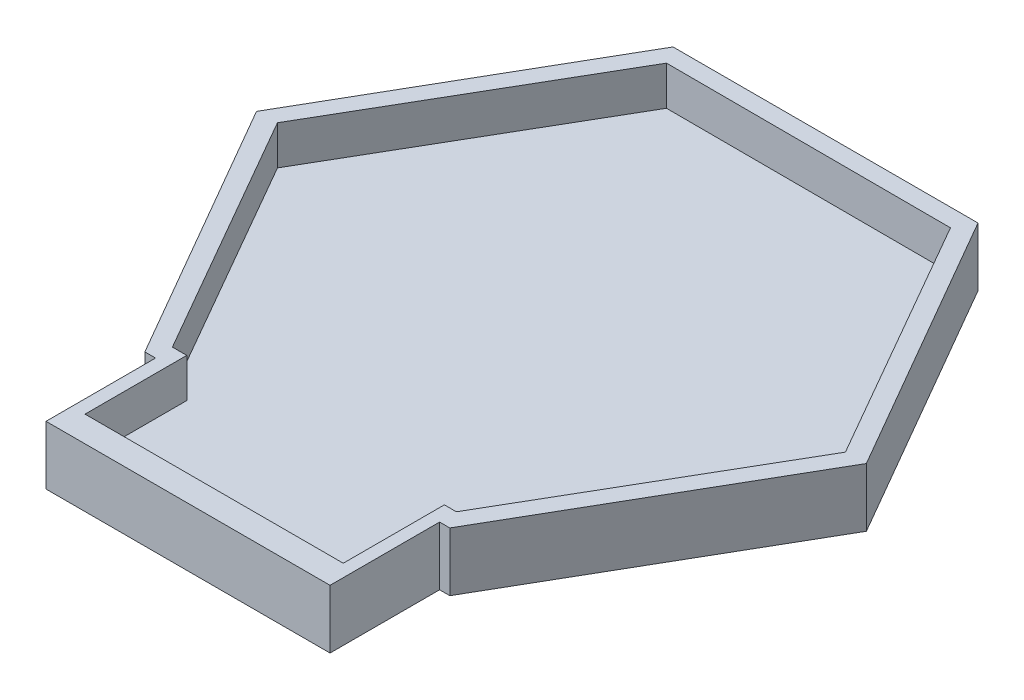
ISO-10303-21;
HEADER;
FILE_DESCRIPTION(('STEP AP214'),'2;1');
FILE_NAME('part.step','',(''),(''),'','','');
FILE_SCHEMA(('AUTOMOTIVE_DESIGN { 1 0 10303 214 1 1 1 1 }'));
ENDSEC;
DATA;
#1=APPLICATION_CONTEXT('core data for automotive mechanical design processes');
#2=APPLICATION_PROTOCOL_DEFINITION('international standard','automotive_design',2000,#1);
#3=PRODUCT_CONTEXT('',#1,'mechanical');
#4=PRODUCT('Part','Part','',(#3));
#5=PRODUCT_RELATED_PRODUCT_CATEGORY('part','',(#4));
#6=PRODUCT_DEFINITION_FORMATION('','',#4);
#7=PRODUCT_DEFINITION_CONTEXT('part definition',#1,'design');
#8=PRODUCT_DEFINITION('design','',#6,#7);
#9=PRODUCT_DEFINITION_SHAPE('','',#8);
#10=(LENGTH_UNIT() NAMED_UNIT(*) SI_UNIT(.MILLI.,.METRE.));
#11=(NAMED_UNIT(*) PLANE_ANGLE_UNIT() SI_UNIT($,.RADIAN.));
#12=(NAMED_UNIT(*) SI_UNIT($,.STERADIAN.) SOLID_ANGLE_UNIT());
#13=UNCERTAINTY_MEASURE_WITH_UNIT(LENGTH_MEASURE(1.E-05),#10,'distance_accuracy_value','');
#14=(GEOMETRIC_REPRESENTATION_CONTEXT(3) GLOBAL_UNCERTAINTY_ASSIGNED_CONTEXT((#13)) GLOBAL_UNIT_ASSIGNED_CONTEXT((#10,
#11,#12)) REPRESENTATION_CONTEXT('',''));
#15=CARTESIAN_POINT('',(0.,0.,0.));
#16=DIRECTION('',(0.,0.,1.));
#17=DIRECTION('',(1.,0.,0.));
#18=AXIS2_PLACEMENT_3D('',#15,#16,#17);
#19=CARTESIAN_POINT('',(5.64870289125176E-13,19.05,85.7250000000002));
#20=DIRECTION('',(0.,0.,-1.));
#21=DIRECTION('',(-1.,0.,0.));
#22=AXIS2_PLACEMENT_3D('',#19,#20,#21);
#23=PLANE('',#22);
#24=DIRECTION('',(1.,0.,0.));
#25=VECTOR('',#24,1.);
#26=CARTESIAN_POINT('',(5.64870289125176E-13,0.,85.7250000000002));
#27=LINE('',#26,#25);
#28=CARTESIAN_POINT('',(-49.4933518262799,0.,85.7250000000005));
#29=VERTEX_POINT('',#28);
#30=CARTESIAN_POINT('',(-46.0239134312924,0.,85.7250000000005));
#31=VERTEX_POINT('',#30);
#32=EDGE_CURVE('E190',#29,#31,#27,.T.);
#33=ORIENTED_EDGE('',*,*,#32,.T.);
#34=DIRECTION('',(0.,-1.,0.));
#35=VECTOR('',#34,1.);
#36=CARTESIAN_POINT('',(-46.0239134312924,19.05,85.7250000000005));
#37=LINE('',#36,#35);
#38=CARTESIAN_POINT('',(-46.0239134312924,19.05,85.7250000000005));
#39=VERTEX_POINT('',#38);
#40=EDGE_CURVE('E12',#39,#31,#37,.T.);
#41=ORIENTED_EDGE('',*,*,#40,.F.);
#42=DIRECTION('',(1.,0.,0.));
#43=VECTOR('',#42,1.);
#44=CARTESIAN_POINT('',(5.64870289125176E-13,19.05,85.7250000000002));
#45=LINE('',#44,#43);
#46=CARTESIAN_POINT('',(-49.4933518262799,19.05,85.7250000000005));
#47=VERTEX_POINT('',#46);
#48=EDGE_CURVE('E211',#47,#39,#45,.T.);
#49=ORIENTED_EDGE('',*,*,#48,.F.);
#50=DIRECTION('',(0.,-1.,0.));
#51=VECTOR('',#50,1.);
#52=CARTESIAN_POINT('',(-49.4933518262799,19.05,85.7250000000005));
#53=LINE('',#52,#51);
#54=EDGE_CURVE('E186',#47,#29,#53,.T.);
#55=ORIENTED_EDGE('',*,*,#54,.T.);
#56=EDGE_LOOP('',(#33,#41,#49,#55));
#57=FACE_BOUND('',#56,.T.);
#58=ADVANCED_FACE('F69',(#57),#23,.F.);
#59=CARTESIAN_POINT('',(-46.0239134312929,19.05,2.6044140939056E-13));
#60=DIRECTION('',(1.,0.,0.));
#61=DIRECTION('',(0.,0.,-1.));
#62=AXIS2_PLACEMENT_3D('',#59,#60,#61);
#63=PLANE('',#62);
#64=DIRECTION('',(0.,0.,1.));
#65=VECTOR('',#64,1.);
#66=CARTESIAN_POINT('',(-46.0239134312929,0.,2.6044140939056E-13));
#67=LINE('',#66,#65);
#68=CARTESIAN_POINT('',(-46.0239134312922,0.,121.285));
#69=VERTEX_POINT('',#68);
#70=EDGE_CURVE('E193',#31,#69,#67,.T.);
#71=ORIENTED_EDGE('',*,*,#70,.T.);
#72=DIRECTION('',(0.,-1.,0.));
#73=VECTOR('',#72,1.);
#74=CARTESIAN_POINT('',(-46.0239134312922,19.05,121.285));
#75=LINE('',#74,#73);
#76=CARTESIAN_POINT('',(-46.0239134312922,19.05,121.285));
#77=VERTEX_POINT('',#76);
#78=EDGE_CURVE('E77',#77,#69,#75,.T.);
#79=ORIENTED_EDGE('',*,*,#78,.F.);
#80=DIRECTION('',(0.,0.,1.));
#81=VECTOR('',#80,1.);
#82=CARTESIAN_POINT('',(-46.0239134312929,19.05,2.6044140939056E-13));
#83=LINE('',#82,#81);
#84=EDGE_CURVE('E140',#39,#77,#83,.T.);
#85=ORIENTED_EDGE('',*,*,#84,.F.);
#86=ORIENTED_EDGE('',*,*,#40,.T.);
#87=EDGE_LOOP('',(#71,#79,#85,#86));
#88=FACE_BOUND('',#87,.T.);
#89=ADVANCED_FACE('F71',(#88),#63,.F.);
#90=CARTESIAN_POINT('',(0.,19.05,121.285));
#91=DIRECTION('',(0.,0.,-1.));
#92=DIRECTION('',(-1.,0.,0.));
#93=AXIS2_PLACEMENT_3D('',#90,#91,#92);
#94=PLANE('',#93);
#95=DIRECTION('',(1.,0.,0.));
#96=VECTOR('',#95,1.);
#97=CARTESIAN_POINT('',(0.,0.,121.285));
#98=LINE('',#97,#96);
#99=CARTESIAN_POINT('',(46.1780865687078,0.,121.285));
#100=VERTEX_POINT('',#99);
#101=EDGE_CURVE('E197',#69,#100,#98,.T.);
#102=ORIENTED_EDGE('',*,*,#101,.T.);
#103=DIRECTION('',(0.,-1.,0.));
#104=VECTOR('',#103,1.);
#105=CARTESIAN_POINT('',(46.1780865687078,19.05,121.285));
#106=LINE('',#105,#104);
#107=CARTESIAN_POINT('',(46.1780865687078,19.05,121.285));
#108=VERTEX_POINT('',#107);
#109=EDGE_CURVE('E223',#108,#100,#106,.T.);
#110=ORIENTED_EDGE('',*,*,#109,.F.);
#111=DIRECTION('',(1.,0.,0.));
#112=VECTOR('',#111,1.);
#113=CARTESIAN_POINT('',(0.,19.05,121.285));
#114=LINE('',#113,#112);
#115=EDGE_CURVE('E230',#77,#108,#114,.T.);
#116=ORIENTED_EDGE('',*,*,#115,.F.);
#117=ORIENTED_EDGE('',*,*,#78,.T.);
#118=EDGE_LOOP('',(#102,#110,#116,#117));
#119=FACE_BOUND('',#118,.T.);
#120=ADVANCED_FACE('F228',(#119),#94,.F.);
#121=CARTESIAN_POINT('',(46.1780865687071,19.05,-2.6131384865538E-13));
#122=DIRECTION('',(1.,0.,0.));
#123=DIRECTION('',(0.,0.,-1.));
#124=AXIS2_PLACEMENT_3D('',#121,#122,#123);
#125=PLANE('',#124);
#126=DIRECTION('',(0.,0.,1.));
#127=VECTOR('',#126,1.);
#128=CARTESIAN_POINT('',(46.1780865687071,0.,-2.6131384865538E-13));
#129=LINE('',#128,#127);
#130=CARTESIAN_POINT('',(46.1780865687076,0.,85.7249999999999));
#131=VERTEX_POINT('',#130);
#132=EDGE_CURVE('E200',#131,#100,#129,.T.);
#133=ORIENTED_EDGE('',*,*,#132,.F.);
#134=DIRECTION('',(0.,-1.,0.));
#135=VECTOR('',#134,1.);
#136=CARTESIAN_POINT('',(46.1780865687076,19.05,85.7249999999999));
#137=LINE('',#136,#135);
#138=CARTESIAN_POINT('',(46.1780865687076,19.05,85.7249999999999));
#139=VERTEX_POINT('',#138);
#140=EDGE_CURVE('E221',#139,#131,#137,.T.);
#141=ORIENTED_EDGE('',*,*,#140,.F.);
#142=DIRECTION('',(0.,0.,1.));
#143=VECTOR('',#142,1.);
#144=CARTESIAN_POINT('',(46.1780865687071,19.05,-2.6131384865538E-13));
#145=LINE('',#144,#143);
#146=EDGE_CURVE('E242',#139,#108,#145,.T.);
#147=ORIENTED_EDGE('',*,*,#146,.T.);
#148=ORIENTED_EDGE('',*,*,#109,.T.);
#149=EDGE_LOOP('',(#133,#141,#147,#148));
#150=FACE_BOUND('',#149,.T.);
#151=ADVANCED_FACE('F238',(#150),#125,.T.);
#152=CARTESIAN_POINT('',(49.4933518262809,0.,85.7249999999999));
#153=VERTEX_POINT('',#152);
#154=EDGE_CURVE('E195',#131,#153,#27,.T.);
#155=ORIENTED_EDGE('',*,*,#154,.T.);
#156=DIRECTION('',(0.,-1.,0.));
#157=VECTOR('',#156,1.);
#158=CARTESIAN_POINT('',(49.4933518262809,19.05,85.7249999999999));
#159=LINE('',#158,#157);
#160=CARTESIAN_POINT('',(49.4933518262809,19.05,85.7249999999999));
#161=VERTEX_POINT('',#160);
#162=EDGE_CURVE('E218',#161,#153,#159,.T.);
#163=ORIENTED_EDGE('',*,*,#162,.F.);
#164=EDGE_CURVE('E243',#139,#161,#45,.T.);
#165=ORIENTED_EDGE('',*,*,#164,.F.);
#166=ORIENTED_EDGE('',*,*,#140,.T.);
#167=EDGE_LOOP('',(#155,#163,#165,#166));
#168=FACE_BOUND('',#167,.T.);
#169=ADVANCED_FACE('F441',(#168),#23,.F.);
#170=CARTESIAN_POINT('',(74.2400277394211,19.05,42.8624999999998));
#171=DIRECTION('',(-0.86602540378444,0.,-0.499999999999998));
#172=DIRECTION('',(-0.499999999999998,0.,0.86602540378444));
#173=AXIS2_PLACEMENT_3D('',#170,#171,#172);
#174=PLANE('',#173);
#175=DIRECTION('',(0.499999999999998,0.,-0.86602540378444));
#176=VECTOR('',#175,1.);
#177=CARTESIAN_POINT('',(74.2400277394211,0.,42.8624999999998));
#178=LINE('',#177,#176);
#179=CARTESIAN_POINT('',(98.9867036525613,0.,-2.08166817117217E-13));
#180=VERTEX_POINT('',#179);
#181=EDGE_CURVE('E203',#153,#180,#178,.T.);
#182=ORIENTED_EDGE('',*,*,#181,.T.);
#183=DIRECTION('',(0.,-1.,0.));
#184=VECTOR('',#183,1.);
#185=CARTESIAN_POINT('',(98.9867036525613,19.05,-2.08166817117217E-13));
#186=LINE('',#185,#184);
#187=CARTESIAN_POINT('',(98.9867036525613,19.05,-2.08166817117217E-13));
#188=VERTEX_POINT('',#187);
#189=EDGE_CURVE('E215',#188,#180,#186,.T.);
#190=ORIENTED_EDGE('',*,*,#189,.F.);
#191=DIRECTION('',(0.499999999999998,0.,-0.86602540378444));
#192=VECTOR('',#191,1.);
#193=CARTESIAN_POINT('',(74.2400277394211,19.05,42.8624999999998));
#194=LINE('',#193,#192);
#195=EDGE_CURVE('E245',#161,#188,#194,.T.);
#196=ORIENTED_EDGE('',*,*,#195,.F.);
#197=ORIENTED_EDGE('',*,*,#162,.T.);
#198=EDGE_LOOP('',(#182,#190,#196,#197));
#199=FACE_BOUND('',#198,.T.);
#200=ADVANCED_FACE('F254',(#199),#174,.F.);
#201=CARTESIAN_POINT('',(74.2400277394209,19.05,-42.8625000000002));
#202=DIRECTION('',(-0.866025403784437,0.,0.500000000000002));
#203=DIRECTION('',(0.500000000000002,0.,0.866025403784437));
#204=AXIS2_PLACEMENT_3D('',#201,#202,#203);
#205=PLANE('',#204);
#206=DIRECTION('',(-0.500000000000002,0.,-0.866025403784437));
#207=VECTOR('',#206,1.);
#208=CARTESIAN_POINT('',(74.2400277394209,0.,-42.8625000000002));
#209=LINE('',#208,#207);
#210=CARTESIAN_POINT('',(49.4933518262804,0.,-85.7250000000001));
#211=VERTEX_POINT('',#210);
#212=EDGE_CURVE('E205',#180,#211,#209,.T.);
#213=ORIENTED_EDGE('',*,*,#212,.T.);
#214=DIRECTION('',(0.,-1.,0.));
#215=VECTOR('',#214,1.);
#216=CARTESIAN_POINT('',(49.4933518262804,19.05,-85.7250000000001));
#217=LINE('',#216,#215);
#218=CARTESIAN_POINT('',(49.4933518262804,19.05,-85.7250000000001));
#219=VERTEX_POINT('',#218);
#220=EDGE_CURVE('E181',#219,#211,#217,.T.);
#221=ORIENTED_EDGE('',*,*,#220,.F.);
#222=DIRECTION('',(-0.500000000000002,0.,-0.866025403784437));
#223=VECTOR('',#222,1.);
#224=CARTESIAN_POINT('',(74.2400277394209,19.05,-42.8625000000002));
#225=LINE('',#224,#223);
#226=EDGE_CURVE('E169',#188,#219,#225,.T.);
#227=ORIENTED_EDGE('',*,*,#226,.F.);
#228=ORIENTED_EDGE('',*,*,#189,.T.);
#229=EDGE_LOOP('',(#213,#221,#227,#228));
#230=FACE_BOUND('',#229,.T.);
#231=ADVANCED_FACE('F257',(#230),#205,.F.);
#232=CARTESIAN_POINT('',(-2.16333302218151E-13,19.05,-85.725));
#233=DIRECTION('',(0.,0.,1.));
#234=DIRECTION('',(1.,0.,0.));
#235=AXIS2_PLACEMENT_3D('',#232,#233,#234);
#236=PLANE('',#235);
#237=DIRECTION('',(-1.,0.,0.));
#238=VECTOR('',#237,1.);
#239=CARTESIAN_POINT('',(-2.16333302218151E-13,0.,-85.725));
#240=LINE('',#239,#238);
#241=CARTESIAN_POINT('',(-49.4933518262811,0.,-85.7249999999999));
#242=VERTEX_POINT('',#241);
#243=EDGE_CURVE('E178',#211,#242,#240,.T.);
#244=ORIENTED_EDGE('',*,*,#243,.T.);
#245=DIRECTION('',(0.,-1.,0.));
#246=VECTOR('',#245,1.);
#247=CARTESIAN_POINT('',(-49.4933518262811,19.05,-85.7249999999999));
#248=LINE('',#247,#246);
#249=CARTESIAN_POINT('',(-49.4933518262811,19.05,-85.7249999999999));
#250=VERTEX_POINT('',#249);
#251=EDGE_CURVE('E175',#250,#242,#248,.T.);
#252=ORIENTED_EDGE('',*,*,#251,.F.);
#253=DIRECTION('',(-1.,0.,0.));
#254=VECTOR('',#253,1.);
#255=CARTESIAN_POINT('',(-2.16333302218151E-13,19.05,-85.725));
#256=LINE('',#255,#254);
#257=EDGE_CURVE('E162',#219,#250,#256,.T.);
#258=ORIENTED_EDGE('',*,*,#257,.F.);
#259=ORIENTED_EDGE('',*,*,#220,.T.);
#260=EDGE_LOOP('',(#244,#252,#258,#259));
#261=FACE_BOUND('',#260,.T.);
#262=ADVANCED_FACE('F176',(#261),#236,.F.);
#263=CARTESIAN_POINT('',(-74.2400277394213,19.05,-42.8624999999996));
#264=DIRECTION('',(0.866025403784442,0.,0.499999999999995));
#265=DIRECTION('',(0.499999999999995,0.,-0.866025403784442));
#266=AXIS2_PLACEMENT_3D('',#263,#264,#265);
#267=PLANE('',#266);
#268=DIRECTION('',(-0.499999999999995,0.,0.866025403784442));
#269=VECTOR('',#268,1.);
#270=CARTESIAN_POINT('',(-74.2400277394213,0.,-42.8624999999996));
#271=LINE('',#270,#269);
#272=CARTESIAN_POINT('',(-98.9867036525614,0.,6.86950496486816E-13));
#273=VERTEX_POINT('',#272);
#274=EDGE_CURVE('E208',#242,#273,#271,.T.);
#275=ORIENTED_EDGE('',*,*,#274,.T.);
#276=DIRECTION('',(0.,-1.,0.));
#277=VECTOR('',#276,1.);
#278=CARTESIAN_POINT('',(-98.9867036525614,19.05,6.86950496486816E-13));
#279=LINE('',#278,#277);
#280=CARTESIAN_POINT('',(-98.9867036525614,19.05,6.86950496486816E-13));
#281=VERTEX_POINT('',#280);
#282=EDGE_CURVE('E182',#281,#273,#279,.T.);
#283=ORIENTED_EDGE('',*,*,#282,.F.);
#284=DIRECTION('',(-0.499999999999995,0.,0.866025403784442));
#285=VECTOR('',#284,1.);
#286=CARTESIAN_POINT('',(-74.2400277394213,19.05,-42.8624999999996));
#287=LINE('',#286,#285);
#288=EDGE_CURVE('E166',#250,#281,#287,.T.);
#289=ORIENTED_EDGE('',*,*,#288,.F.);
#290=ORIENTED_EDGE('',*,*,#251,.T.);
#291=EDGE_LOOP('',(#275,#283,#289,#290));
#292=FACE_BOUND('',#291,.T.);
#293=ADVANCED_FACE('F184',(#292),#267,.F.);
#294=CARTESIAN_POINT('',(-74.2400277394207,19.05,42.8625000000006));
#295=DIRECTION('',(0.866025403784434,0.,-0.500000000000007));
#296=DIRECTION('',(-0.500000000000007,0.,-0.866025403784435));
#297=AXIS2_PLACEMENT_3D('',#294,#295,#296);
#298=PLANE('',#297);
#299=DIRECTION('',(0.500000000000007,0.,0.866025403784435));
#300=VECTOR('',#299,1.);
#301=CARTESIAN_POINT('',(-74.2400277394207,0.,42.8625000000006));
#302=LINE('',#301,#300);
#303=EDGE_CURVE('E132',#273,#29,#302,.T.);
#304=ORIENTED_EDGE('',*,*,#303,.T.);
#305=ORIENTED_EDGE('',*,*,#54,.F.);
#306=DIRECTION('',(0.500000000000007,0.,0.866025403784435));
#307=VECTOR('',#306,1.);
#308=CARTESIAN_POINT('',(-74.2400277394207,19.05,42.8625000000006));
#309=LINE('',#308,#307);
#310=EDGE_CURVE('E93',#281,#47,#309,.T.);
#311=ORIENTED_EDGE('',*,*,#310,.F.);
#312=ORIENTED_EDGE('',*,*,#282,.T.);
#313=EDGE_LOOP('',(#304,#305,#311,#312));
#314=FACE_BOUND('',#313,.T.);
#315=ADVANCED_FACE('F258',(#314),#298,.F.);
#316=CARTESIAN_POINT('',(0.,19.05,0.));
#317=DIRECTION('',(0.,1.,0.));
#318=DIRECTION('',(0.,0.,1.));
#319=AXIS2_PLACEMENT_3D('',#316,#317,#318);
#320=PLANE('',#319);
#321=DIRECTION('',(0.498029058173314,0.,0.867160341122103));
#322=VECTOR('',#321,1.);
#323=CARTESIAN_POINT('',(-92.387351129337,19.05,-0.21012211830998));
#324=LINE('',#323,#322);
#325=CARTESIAN_POINT('',(-92.387351129337,19.05,-0.21012211830998));
#326=VERTEX_POINT('',#325);
#327=CARTESIAN_POINT('',(-46.3756466570219,19.05,79.9047320072038));
#328=VERTEX_POINT('',#327);
#329=EDGE_CURVE('E299',#326,#328,#324,.T.);
#330=ORIENTED_EDGE('',*,*,#329,.F.);
#331=DIRECTION('',(-0.501968355479463,0.,0.86488598676198));
#332=VECTOR('',#331,1.);
#333=CARTESIAN_POINT('',(-46.011704472315,19.05,-80.1148541255137));
#334=LINE('',#333,#332);
#335=CARTESIAN_POINT('',(-46.011704472315,19.05,-80.1148541255137));
#336=VERTEX_POINT('',#335);
#337=EDGE_CURVE('E282',#336,#326,#334,.T.);
#338=ORIENTED_EDGE('',*,*,#337,.F.);
#339=DIRECTION('',(-0.999997413652778,0.,-0.00227435436012316));
#340=VECTOR('',#339,1.);
#341=CARTESIAN_POINT('',(46.3756466570219,19.05,-79.9047320072037));
#342=LINE('',#341,#340);
#343=CARTESIAN_POINT('',(46.3756466570219,19.05,-79.9047320072037));
#344=VERTEX_POINT('',#343);
#345=EDGE_CURVE('E286',#344,#336,#342,.T.);
#346=ORIENTED_EDGE('',*,*,#345,.F.);
#347=DIRECTION('',(-0.498029058173314,0.,-0.867160341122103));
#348=VECTOR('',#347,1.);
#349=CARTESIAN_POINT('',(92.3873511293369,19.05,0.21012211831001));
#350=LINE('',#349,#348);
#351=CARTESIAN_POINT('',(92.3873511293369,19.05,0.21012211831001));
#352=VERTEX_POINT('',#351);
#353=EDGE_CURVE('E289',#352,#344,#350,.T.);
#354=ORIENTED_EDGE('',*,*,#353,.F.);
#355=DIRECTION('',(0.501968355479464,0.,-0.864885986761979));
#356=VECTOR('',#355,1.);
#357=CARTESIAN_POINT('',(46.011704472315,19.05,80.1148541255137));
#358=LINE('',#357,#356);
#359=CARTESIAN_POINT('',(46.011704472315,19.05,80.1148541255137));
#360=VERTEX_POINT('',#359);
#361=EDGE_CURVE('E292',#360,#352,#358,.T.);
#362=ORIENTED_EDGE('',*,*,#361,.F.);
#363=DIRECTION('',(0.999997413652778,0.,0.00227435436012316));
#364=VECTOR('',#363,1.);
#365=CARTESIAN_POINT('',(-46.3756466570219,19.05,79.9047320072038));
#366=LINE('',#365,#364);
#367=CARTESIAN_POINT('',(42.1145877624479,19.05,80.1059906782088));
#368=VERTEX_POINT('',#367);
#369=EDGE_CURVE('E298',#368,#360,#366,.T.);
#370=ORIENTED_EDGE('',*,*,#369,.F.);
#371=DIRECTION('',(0.,0.,1.));
#372=VECTOR('',#371,1.);
#373=CARTESIAN_POINT('',(42.1145877624479,19.05,0.));
#374=LINE('',#373,#372);
#375=CARTESIAN_POINT('',(42.1145877624479,19.05,112.93535380269));
#376=VERTEX_POINT('',#375);
#377=EDGE_CURVE('E84',#368,#376,#374,.T.);
#378=ORIENTED_EDGE('',*,*,#377,.T.);
#379=DIRECTION('',(1.,0.,0.));
#380=VECTOR('',#379,1.);
#381=CARTESIAN_POINT('',(0.,19.05,112.93535380269));
#382=LINE('',#381,#380);
#383=CARTESIAN_POINT('',(-41.7054122375521,19.05,112.93535380269));
#384=VERTEX_POINT('',#383);
#385=EDGE_CURVE('E329',#384,#376,#382,.T.);
#386=ORIENTED_EDGE('',*,*,#385,.F.);
#387=DIRECTION('',(0.,0.,1.));
#388=VECTOR('',#387,1.);
#389=CARTESIAN_POINT('',(-41.7054122375521,19.05,0.));
#390=LINE('',#389,#388);
#391=CARTESIAN_POINT('',(-41.7054122375611,19.05,79.9153538026901));
#392=VERTEX_POINT('',#391);
#393=EDGE_CURVE('E333',#392,#384,#390,.T.);
#394=ORIENTED_EDGE('',*,*,#393,.F.);
#395=EDGE_CURVE('E295',#328,#392,#366,.T.);
#396=ORIENTED_EDGE('',*,*,#395,.F.);
#397=EDGE_LOOP('',(#330,#338,#346,#354,#362,#370,#378,#386,#394,#396));
#398=FACE_BOUND('',#397,.T.);
#399=ORIENTED_EDGE('',*,*,#48,.T.);
#400=ORIENTED_EDGE('',*,*,#84,.T.);
#401=ORIENTED_EDGE('',*,*,#115,.T.);
#402=ORIENTED_EDGE('',*,*,#146,.F.);
#403=ORIENTED_EDGE('',*,*,#164,.T.);
#404=ORIENTED_EDGE('',*,*,#195,.T.);
#405=ORIENTED_EDGE('',*,*,#226,.T.);
#406=ORIENTED_EDGE('',*,*,#257,.T.);
#407=ORIENTED_EDGE('',*,*,#288,.T.);
#408=ORIENTED_EDGE('',*,*,#310,.T.);
#409=EDGE_LOOP('',(#399,#400,#401,#402,#403,#404,#405,#406,#407,#408));
#410=FACE_BOUND('',#409,.T.);
#411=ADVANCED_FACE('F164',(#398,#410),#320,.T.);
#412=CARTESIAN_POINT('',(0.,0.,0.));
#413=DIRECTION('',(0.,1.,0.));
#414=DIRECTION('',(0.,0.,1.));
#415=AXIS2_PLACEMENT_3D('',#412,#413,#414);
#416=PLANE('',#415);
#417=ORIENTED_EDGE('',*,*,#32,.F.);
#418=ORIENTED_EDGE('',*,*,#303,.F.);
#419=ORIENTED_EDGE('',*,*,#274,.F.);
#420=ORIENTED_EDGE('',*,*,#243,.F.);
#421=ORIENTED_EDGE('',*,*,#212,.F.);
#422=ORIENTED_EDGE('',*,*,#181,.F.);
#423=ORIENTED_EDGE('',*,*,#154,.F.);
#424=ORIENTED_EDGE('',*,*,#132,.T.);
#425=ORIENTED_EDGE('',*,*,#101,.F.);
#426=ORIENTED_EDGE('',*,*,#70,.F.);
#427=EDGE_LOOP('',(#417,#418,#419,#420,#421,#422,#423,#424,#425,#426));
#428=FACE_BOUND('',#427,.T.);
#429=ADVANCED_FACE('F233',(#428),#416,.F.);
#430=CARTESIAN_POINT('',(42.1145877624479,6.35,0.));
#431=DIRECTION('',(-1.,0.,0.));
#432=DIRECTION('',(0.,0.,1.));
#433=AXIS2_PLACEMENT_3D('',#430,#431,#432);
#434=PLANE('',#433);
#435=ORIENTED_EDGE('',*,*,#377,.F.);
#436=DIRECTION('',(0.,1.,0.));
#437=VECTOR('',#436,1.);
#438=CARTESIAN_POINT('',(42.1145877624479,6.35,80.1059906782088));
#439=LINE('',#438,#437);
#440=CARTESIAN_POINT('',(42.1145877624479,6.35,80.1059906782088));
#441=VERTEX_POINT('',#440);
#442=EDGE_CURVE('E319',#441,#368,#439,.T.);
#443=ORIENTED_EDGE('',*,*,#442,.F.);
#444=DIRECTION('',(0.,0.,1.));
#445=VECTOR('',#444,1.);
#446=CARTESIAN_POINT('',(42.1145877624479,6.35,0.));
#447=LINE('',#446,#445);
#448=CARTESIAN_POINT('',(42.1145877624479,6.35,112.93535380269));
#449=VERTEX_POINT('',#448);
#450=EDGE_CURVE('E332',#441,#449,#447,.T.);
#451=ORIENTED_EDGE('',*,*,#450,.T.);
#452=DIRECTION('',(0.,1.,0.));
#453=VECTOR('',#452,1.);
#454=CARTESIAN_POINT('',(42.1145877624479,6.35,112.93535380269));
#455=LINE('',#454,#453);
#456=EDGE_CURVE('E194',#449,#376,#455,.T.);
#457=ORIENTED_EDGE('',*,*,#456,.T.);
#458=EDGE_LOOP('',(#435,#443,#451,#457));
#459=FACE_BOUND('',#458,.T.);
#460=ADVANCED_FACE('F345',(#459),#434,.T.);
#461=CARTESIAN_POINT('',(0.,6.35,112.93535380269));
#462=DIRECTION('',(0.,0.,1.));
#463=DIRECTION('',(1.,0.,0.));
#464=AXIS2_PLACEMENT_3D('',#461,#462,#463);
#465=PLANE('',#464);
#466=ORIENTED_EDGE('',*,*,#385,.T.);
#467=ORIENTED_EDGE('',*,*,#456,.F.);
#468=DIRECTION('',(1.,0.,0.));
#469=VECTOR('',#468,1.);
#470=CARTESIAN_POINT('',(0.,6.35,112.93535380269));
#471=LINE('',#470,#469);
#472=CARTESIAN_POINT('',(-41.7054122375521,6.35,112.93535380269));
#473=VERTEX_POINT('',#472);
#474=EDGE_CURVE('E322',#473,#449,#471,.T.);
#475=ORIENTED_EDGE('',*,*,#474,.F.);
#476=DIRECTION('',(0.,1.,0.));
#477=VECTOR('',#476,1.);
#478=CARTESIAN_POINT('',(-41.7054122375521,6.35,112.93535380269));
#479=LINE('',#478,#477);
#480=EDGE_CURVE('E325',#473,#384,#479,.T.);
#481=ORIENTED_EDGE('',*,*,#480,.T.);
#482=EDGE_LOOP('',(#466,#467,#475,#481));
#483=FACE_BOUND('',#482,.T.);
#484=ADVANCED_FACE('F355',(#483),#465,.F.);
#485=CARTESIAN_POINT('',(-41.7054122375521,6.35,0.));
#486=DIRECTION('',(-1.,0.,0.));
#487=DIRECTION('',(0.,0.,1.));
#488=AXIS2_PLACEMENT_3D('',#485,#486,#487);
#489=PLANE('',#488);
#490=ORIENTED_EDGE('',*,*,#393,.T.);
#491=ORIENTED_EDGE('',*,*,#480,.F.);
#492=DIRECTION('',(0.,0.,1.));
#493=VECTOR('',#492,1.);
#494=CARTESIAN_POINT('',(-41.7054122375521,6.35,0.));
#495=LINE('',#494,#493);
#496=CARTESIAN_POINT('',(-41.7054122375611,6.35,79.9153538026901));
#497=VERTEX_POINT('',#496);
#498=EDGE_CURVE('E339',#497,#473,#495,.T.);
#499=ORIENTED_EDGE('',*,*,#498,.F.);
#500=DIRECTION('',(0.,1.,0.));
#501=VECTOR('',#500,1.);
#502=CARTESIAN_POINT('',(-41.7054122375611,6.35,79.9153538026901));
#503=LINE('',#502,#501);
#504=EDGE_CURVE('E321',#497,#392,#503,.T.);
#505=ORIENTED_EDGE('',*,*,#504,.T.);
#506=EDGE_LOOP('',(#490,#491,#499,#505));
#507=FACE_BOUND('',#506,.T.);
#508=ADVANCED_FACE('F364',(#507),#489,.F.);
#509=CARTESIAN_POINT('',(0.,6.35,0.));
#510=DIRECTION('',(0.,1.,0.));
#511=DIRECTION('',(0.,0.,1.));
#512=AXIS2_PLACEMENT_3D('',#509,#510,#511);
#513=PLANE('',#512);
#514=ORIENTED_EDGE('',*,*,#450,.F.);
#515=DIRECTION('',(0.999997413652778,0.,0.00227435436012316));
#516=VECTOR('',#515,1.);
#517=CARTESIAN_POINT('',(-46.3756466570219,6.35,79.9047320072038));
#518=LINE('',#517,#516);
#519=CARTESIAN_POINT('',(46.011704472315,6.35,80.1148541255137));
#520=VERTEX_POINT('',#519);
#521=EDGE_CURVE('E316',#441,#520,#518,.T.);
#522=ORIENTED_EDGE('',*,*,#521,.T.);
#523=DIRECTION('',(0.501968355479464,0.,-0.864885986761979));
#524=VECTOR('',#523,1.);
#525=CARTESIAN_POINT('',(46.011704472315,6.35,80.1148541255137));
#526=LINE('',#525,#524);
#527=CARTESIAN_POINT('',(92.3873511293369,6.35,0.21012211831001));
#528=VERTEX_POINT('',#527);
#529=EDGE_CURVE('E310',#520,#528,#526,.T.);
#530=ORIENTED_EDGE('',*,*,#529,.T.);
#531=DIRECTION('',(-0.498029058173314,0.,-0.867160341122103));
#532=VECTOR('',#531,1.);
#533=CARTESIAN_POINT('',(92.3873511293369,6.35,0.21012211831001));
#534=LINE('',#533,#532);
#535=CARTESIAN_POINT('',(46.3756466570219,6.35,-79.9047320072037));
#536=VERTEX_POINT('',#535);
#537=EDGE_CURVE('E307',#528,#536,#534,.T.);
#538=ORIENTED_EDGE('',*,*,#537,.T.);
#539=DIRECTION('',(-0.999997413652778,0.,-0.00227435436012316));
#540=VECTOR('',#539,1.);
#541=CARTESIAN_POINT('',(46.3756466570219,6.35,-79.9047320072037));
#542=LINE('',#541,#540);
#543=CARTESIAN_POINT('',(-46.011704472315,6.35,-80.1148541255137));
#544=VERTEX_POINT('',#543);
#545=EDGE_CURVE('E304',#536,#544,#542,.T.);
#546=ORIENTED_EDGE('',*,*,#545,.T.);
#547=DIRECTION('',(-0.501968355479463,0.,0.86488598676198));
#548=VECTOR('',#547,1.);
#549=CARTESIAN_POINT('',(-46.011704472315,6.35,-80.1148541255137));
#550=LINE('',#549,#548);
#551=CARTESIAN_POINT('',(-92.387351129337,6.35,-0.21012211830998));
#552=VERTEX_POINT('',#551);
#553=EDGE_CURVE('E267',#544,#552,#550,.T.);
#554=ORIENTED_EDGE('',*,*,#553,.T.);
#555=DIRECTION('',(0.498029058173314,0.,0.867160341122103));
#556=VECTOR('',#555,1.);
#557=CARTESIAN_POINT('',(-92.387351129337,6.35,-0.21012211830998));
#558=LINE('',#557,#556);
#559=CARTESIAN_POINT('',(-46.3756466570219,6.35,79.9047320072038));
#560=VERTEX_POINT('',#559);
#561=EDGE_CURVE('E285',#552,#560,#558,.T.);
#562=ORIENTED_EDGE('',*,*,#561,.T.);
#563=EDGE_CURVE('E313',#560,#497,#518,.T.);
#564=ORIENTED_EDGE('',*,*,#563,.T.);
#565=ORIENTED_EDGE('',*,*,#498,.T.);
#566=ORIENTED_EDGE('',*,*,#474,.T.);
#567=EDGE_LOOP('',(#514,#522,#530,#538,#546,#554,#562,#564,#565,#566));
#568=FACE_BOUND('',#567,.T.);
#569=ADVANCED_FACE('F357',(#568),#513,.T.);
#570=CARTESIAN_POINT('',(92.3873511293369,6.35,0.21012211831001));
#571=DIRECTION('',(0.867160341122103,0.,-0.498029058173314));
#572=DIRECTION('',(-0.498029058173314,0.,-0.867160341122103));
#573=AXIS2_PLACEMENT_3D('',#570,#571,#572);
#574=PLANE('',#573);
#575=ORIENTED_EDGE('',*,*,#353,.T.);
#576=DIRECTION('',(0.,1.,0.));
#577=VECTOR('',#576,1.);
#578=CARTESIAN_POINT('',(46.3756466570219,6.35,-79.9047320072037));
#579=LINE('',#578,#577);
#580=EDGE_CURVE('E273',#536,#344,#579,.T.);
#581=ORIENTED_EDGE('',*,*,#580,.F.);
#582=ORIENTED_EDGE('',*,*,#537,.F.);
#583=DIRECTION('',(0.,1.,0.));
#584=VECTOR('',#583,1.);
#585=CARTESIAN_POINT('',(92.3873511293369,6.35,0.21012211831001));
#586=LINE('',#585,#584);
#587=EDGE_CURVE('E270',#528,#352,#586,.T.);
#588=ORIENTED_EDGE('',*,*,#587,.T.);
#589=EDGE_LOOP('',(#575,#581,#582,#588));
#590=FACE_BOUND('',#589,.T.);
#591=ADVANCED_FACE('F422',(#590),#574,.F.);
#592=CARTESIAN_POINT('',(46.3756466570219,6.35,-79.9047320072037));
#593=DIRECTION('',(0.00227435436012316,0.,-0.999997413652778));
#594=DIRECTION('',(-0.999997413652778,0.,-0.00227435436012316));
#595=AXIS2_PLACEMENT_3D('',#592,#593,#594);
#596=PLANE('',#595);
#597=ORIENTED_EDGE('',*,*,#345,.T.);
#598=DIRECTION('',(0.,1.,0.));
#599=VECTOR('',#598,1.);
#600=CARTESIAN_POINT('',(-46.011704472315,6.35,-80.1148541255137));
#601=LINE('',#600,#599);
#602=EDGE_CURVE('E276',#544,#336,#601,.T.);
#603=ORIENTED_EDGE('',*,*,#602,.F.);
#604=ORIENTED_EDGE('',*,*,#545,.F.);
#605=ORIENTED_EDGE('',*,*,#580,.T.);
#606=EDGE_LOOP('',(#597,#603,#604,#605));
#607=FACE_BOUND('',#606,.T.);
#608=ADVANCED_FACE('F417',(#607),#596,.F.);
#609=CARTESIAN_POINT('',(-46.011704472315,6.35,-80.1148541255137));
#610=DIRECTION('',(-0.864885986761979,0.,-0.501968355479463));
#611=DIRECTION('',(-0.501968355479463,0.,0.86488598676198));
#612=AXIS2_PLACEMENT_3D('',#609,#610,#611);
#613=PLANE('',#612);
#614=ORIENTED_EDGE('',*,*,#337,.T.);
#615=DIRECTION('',(0.,1.,0.));
#616=VECTOR('',#615,1.);
#617=CARTESIAN_POINT('',(-92.387351129337,6.35,-0.21012211830998));
#618=LINE('',#617,#616);
#619=EDGE_CURVE('E279',#552,#326,#618,.T.);
#620=ORIENTED_EDGE('',*,*,#619,.F.);
#621=ORIENTED_EDGE('',*,*,#553,.F.);
#622=ORIENTED_EDGE('',*,*,#602,.T.);
#623=EDGE_LOOP('',(#614,#620,#621,#622));
#624=FACE_BOUND('',#623,.T.);
#625=ADVANCED_FACE('F409',(#624),#613,.F.);
#626=CARTESIAN_POINT('',(46.011704472315,6.35,80.1148541255137));
#627=DIRECTION('',(0.864885986761979,0.,0.501968355479464));
#628=DIRECTION('',(0.501968355479464,0.,-0.86488598676198));
#629=AXIS2_PLACEMENT_3D('',#626,#627,#628);
#630=PLANE('',#629);
#631=ORIENTED_EDGE('',*,*,#361,.T.);
#632=ORIENTED_EDGE('',*,*,#587,.F.);
#633=ORIENTED_EDGE('',*,*,#529,.F.);
#634=DIRECTION('',(0.,1.,0.));
#635=VECTOR('',#634,1.);
#636=CARTESIAN_POINT('',(46.011704472315,6.35,80.1148541255137));
#637=LINE('',#636,#635);
#638=EDGE_CURVE('E266',#520,#360,#637,.T.);
#639=ORIENTED_EDGE('',*,*,#638,.T.);
#640=EDGE_LOOP('',(#631,#632,#633,#639));
#641=FACE_BOUND('',#640,.T.);
#642=ADVANCED_FACE('F425',(#641),#630,.F.);
#643=CARTESIAN_POINT('',(-92.387351129337,6.35,-0.21012211830998));
#644=DIRECTION('',(-0.867160341122103,0.,0.498029058173314));
#645=DIRECTION('',(0.498029058173314,0.,0.867160341122103));
#646=AXIS2_PLACEMENT_3D('',#643,#644,#645);
#647=PLANE('',#646);
#648=ORIENTED_EDGE('',*,*,#329,.T.);
#649=DIRECTION('',(0.,1.,0.));
#650=VECTOR('',#649,1.);
#651=CARTESIAN_POINT('',(-46.3756466570219,6.35,79.9047320072038));
#652=LINE('',#651,#650);
#653=EDGE_CURVE('E263',#560,#328,#652,.T.);
#654=ORIENTED_EDGE('',*,*,#653,.F.);
#655=ORIENTED_EDGE('',*,*,#561,.F.);
#656=ORIENTED_EDGE('',*,*,#619,.T.);
#657=EDGE_LOOP('',(#648,#654,#655,#656));
#658=FACE_BOUND('',#657,.T.);
#659=ADVANCED_FACE('F405',(#658),#647,.F.);
#660=CARTESIAN_POINT('',(-46.3756466570219,6.35,79.9047320072038));
#661=DIRECTION('',(-0.00227435436012316,0.,0.999997413652778));
#662=DIRECTION('',(0.999997413652778,0.,0.00227435436012316));
#663=AXIS2_PLACEMENT_3D('',#660,#661,#662);
#664=PLANE('',#663);
#665=ORIENTED_EDGE('',*,*,#563,.F.);
#666=ORIENTED_EDGE('',*,*,#653,.T.);
#667=ORIENTED_EDGE('',*,*,#395,.T.);
#668=ORIENTED_EDGE('',*,*,#504,.F.);
#669=EDGE_LOOP('',(#665,#666,#667,#668));
#670=FACE_BOUND('',#669,.T.);
#671=ADVANCED_FACE('F413',(#670),#664,.F.);
#672=ORIENTED_EDGE('',*,*,#442,.T.);
#673=ORIENTED_EDGE('',*,*,#369,.T.);
#674=ORIENTED_EDGE('',*,*,#638,.F.);
#675=ORIENTED_EDGE('',*,*,#521,.F.);
#676=EDGE_LOOP('',(#672,#673,#674,#675));
#677=FACE_BOUND('',#676,.T.);
#678=ADVANCED_FACE('F428',(#677),#664,.F.);
#679=CLOSED_SHELL('',(#58,#89,#120,#151,#169,#200,#231,#262,#293,#315,#411,#429,#460,#484,#508,
#569,#591,#608,#625,#642,#659,#671,#678));
#680=MANIFOLD_SOLID_BREP('B2',#679);
#681=ADVANCED_BREP_SHAPE_REPRESENTATION('',(#18,#680),#14);
#682=SHAPE_DEFINITION_REPRESENTATION(#9,#681);
ENDSEC;
END-ISO-10303-21;
